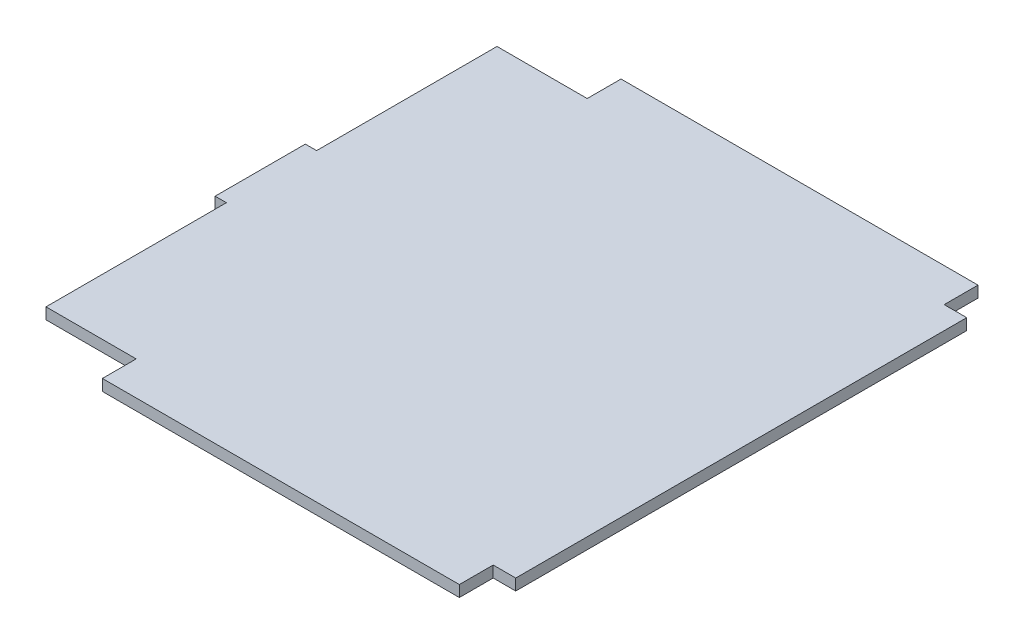
ISO-10303-21;
HEADER;
FILE_DESCRIPTION(('STEP AP214'),'2;1');
FILE_NAME('part.step','',(''),(''),'','','');
FILE_SCHEMA(('AUTOMOTIVE_DESIGN { 1 0 10303 214 1 1 1 1 }'));
ENDSEC;
DATA;
#1=APPLICATION_CONTEXT('core data for automotive mechanical design processes');
#2=APPLICATION_PROTOCOL_DEFINITION('international standard','automotive_design',2000,#1);
#3=PRODUCT_CONTEXT('',#1,'mechanical');
#4=PRODUCT('Part','Part','',(#3));
#5=PRODUCT_RELATED_PRODUCT_CATEGORY('part','',(#4));
#6=PRODUCT_DEFINITION_FORMATION('','',#4);
#7=PRODUCT_DEFINITION_CONTEXT('part definition',#1,'design');
#8=PRODUCT_DEFINITION('design','',#6,#7);
#9=PRODUCT_DEFINITION_SHAPE('','',#8);
#10=(LENGTH_UNIT() NAMED_UNIT(*) SI_UNIT(.MILLI.,.METRE.));
#11=(NAMED_UNIT(*) PLANE_ANGLE_UNIT() SI_UNIT($,.RADIAN.));
#12=(NAMED_UNIT(*) SI_UNIT($,.STERADIAN.) SOLID_ANGLE_UNIT());
#13=UNCERTAINTY_MEASURE_WITH_UNIT(LENGTH_MEASURE(1.E-05),#10,'distance_accuracy_value','');
#14=(GEOMETRIC_REPRESENTATION_CONTEXT(3) GLOBAL_UNCERTAINTY_ASSIGNED_CONTEXT((#13)) GLOBAL_UNIT_ASSIGNED_CONTEXT((#10,
#11,#12)) REPRESENTATION_CONTEXT('',''));
#15=CARTESIAN_POINT('',(0.,0.,0.));
#16=DIRECTION('',(0.,0.,1.));
#17=DIRECTION('',(1.,0.,0.));
#18=AXIS2_PLACEMENT_3D('',#15,#16,#17);
#19=CARTESIAN_POINT('',(0.,3.175,73.025));
#20=DIRECTION('',(0.,0.,1.));
#21=DIRECTION('',(1.,0.,0.));
#22=AXIS2_PLACEMENT_3D('',#19,#20,#21);
#23=PLANE('',#22);
#24=DIRECTION('',(-1.,0.,0.));
#25=VECTOR('',#24,1.);
#26=CARTESIAN_POINT('',(0.,0.,73.025));
#27=LINE('',#26,#25);
#28=CARTESIAN_POINT('',(59.7862566020001,0.,73.025));
#29=VERTEX_POINT('',#28);
#30=CARTESIAN_POINT('',(-40.7362566019999,0.,73.025));
#31=VERTEX_POINT('',#30);
#32=EDGE_CURVE('E249',#29,#31,#27,.T.);
#33=ORIENTED_EDGE('',*,*,#32,.F.);
#34=DIRECTION('',(0.,-1.,0.));
#35=VECTOR('',#34,1.);
#36=CARTESIAN_POINT('',(59.7862566020001,3.175,73.025));
#37=LINE('',#36,#35);
#38=CARTESIAN_POINT('',(59.7862566020001,3.175,73.025));
#39=VERTEX_POINT('',#38);
#40=EDGE_CURVE('E11',#39,#29,#37,.T.);
#41=ORIENTED_EDGE('',*,*,#40,.F.);
#42=DIRECTION('',(-1.,0.,0.));
#43=VECTOR('',#42,1.);
#44=CARTESIAN_POINT('',(0.,3.175,73.025));
#45=LINE('',#44,#43);
#46=CARTESIAN_POINT('',(-40.7362566019999,3.175,73.025));
#47=VERTEX_POINT('',#46);
#48=EDGE_CURVE('E204',#39,#47,#45,.T.);
#49=ORIENTED_EDGE('',*,*,#48,.T.);
#50=DIRECTION('',(0.,-1.,0.));
#51=VECTOR('',#50,1.);
#52=CARTESIAN_POINT('',(-40.7362566019999,3.175,73.025));
#53=LINE('',#52,#51);
#54=EDGE_CURVE('E51',#47,#31,#53,.T.);
#55=ORIENTED_EDGE('',*,*,#54,.T.);
#56=EDGE_LOOP('',(#33,#41,#49,#55));
#57=FACE_BOUND('',#56,.T.);
#58=ADVANCED_FACE('F35',(#57),#23,.T.);
#59=CARTESIAN_POINT('',(59.7862566020001,3.175,0.));
#60=DIRECTION('',(-1.,0.,0.));
#61=DIRECTION('',(0.,0.,1.));
#62=AXIS2_PLACEMENT_3D('',#59,#60,#61);
#63=PLANE('',#62);
#64=DIRECTION('',(0.,0.,-1.));
#65=VECTOR('',#64,1.);
#66=CARTESIAN_POINT('',(59.7862566020001,0.,0.));
#67=LINE('',#66,#65);
#68=CARTESIAN_POINT('',(59.7862566020001,0.,63.5));
#69=VERTEX_POINT('',#68);
#70=EDGE_CURVE('E247',#29,#69,#67,.T.);
#71=ORIENTED_EDGE('',*,*,#70,.T.);
#72=DIRECTION('',(0.,-1.,0.));
#73=VECTOR('',#72,1.);
#74=CARTESIAN_POINT('',(59.7862566020001,3.175,63.5));
#75=LINE('',#74,#73);
#76=CARTESIAN_POINT('',(59.7862566020001,3.175,63.5));
#77=VERTEX_POINT('',#76);
#78=EDGE_CURVE('E43',#77,#69,#75,.T.);
#79=ORIENTED_EDGE('',*,*,#78,.F.);
#80=DIRECTION('',(0.,0.,-1.));
#81=VECTOR('',#80,1.);
#82=CARTESIAN_POINT('',(59.7862566020001,3.175,0.));
#83=LINE('',#82,#81);
#84=EDGE_CURVE('E202',#39,#77,#83,.T.);
#85=ORIENTED_EDGE('',*,*,#84,.F.);
#86=ORIENTED_EDGE('',*,*,#40,.T.);
#87=EDGE_LOOP('',(#71,#79,#85,#86));
#88=FACE_BOUND('',#87,.T.);
#89=ADVANCED_FACE('F248',(#88),#63,.F.);
#90=CARTESIAN_POINT('',(0.,3.175,63.5));
#91=DIRECTION('',(0.,0.,1.));
#92=DIRECTION('',(1.,0.,0.));
#93=AXIS2_PLACEMENT_3D('',#90,#91,#92);
#94=PLANE('',#93);
#95=DIRECTION('',(-1.,0.,0.));
#96=VECTOR('',#95,1.);
#97=CARTESIAN_POINT('',(0.,0.,63.5));
#98=LINE('',#97,#96);
#99=CARTESIAN_POINT('',(66.136256602,0.,63.5));
#100=VERTEX_POINT('',#99);
#101=EDGE_CURVE('E243',#100,#69,#98,.T.);
#102=ORIENTED_EDGE('',*,*,#101,.F.);
#103=DIRECTION('',(0.,-1.,0.));
#104=VECTOR('',#103,1.);
#105=CARTESIAN_POINT('',(66.136256602,3.175,63.5));
#106=LINE('',#105,#104);
#107=CARTESIAN_POINT('',(66.136256602,3.175,63.5));
#108=VERTEX_POINT('',#107);
#109=EDGE_CURVE('E236',#108,#100,#106,.T.);
#110=ORIENTED_EDGE('',*,*,#109,.F.);
#111=DIRECTION('',(-1.,0.,0.));
#112=VECTOR('',#111,1.);
#113=CARTESIAN_POINT('',(0.,3.175,63.5));
#114=LINE('',#113,#112);
#115=EDGE_CURVE('E199',#108,#77,#114,.T.);
#116=ORIENTED_EDGE('',*,*,#115,.T.);
#117=ORIENTED_EDGE('',*,*,#78,.T.);
#118=EDGE_LOOP('',(#102,#110,#116,#117));
#119=FACE_BOUND('',#118,.T.);
#120=ADVANCED_FACE('F241',(#119),#94,.T.);
#121=CARTESIAN_POINT('',(66.136256602,3.175,0.));
#122=DIRECTION('',(-1.,0.,0.));
#123=DIRECTION('',(0.,0.,1.));
#124=AXIS2_PLACEMENT_3D('',#121,#122,#123);
#125=PLANE('',#124);
#126=DIRECTION('',(0.,0.,-1.));
#127=VECTOR('',#126,1.);
#128=CARTESIAN_POINT('',(66.136256602,0.,0.));
#129=LINE('',#128,#127);
#130=CARTESIAN_POINT('',(66.136256602,0.,-63.5));
#131=VERTEX_POINT('',#130);
#132=EDGE_CURVE('E254',#100,#131,#129,.T.);
#133=ORIENTED_EDGE('',*,*,#132,.T.);
#134=DIRECTION('',(0.,-1.,0.));
#135=VECTOR('',#134,1.);
#136=CARTESIAN_POINT('',(66.136256602,3.175,-63.5));
#137=LINE('',#136,#135);
#138=CARTESIAN_POINT('',(66.136256602,3.175,-63.5));
#139=VERTEX_POINT('',#138);
#140=EDGE_CURVE('E233',#139,#131,#137,.T.);
#141=ORIENTED_EDGE('',*,*,#140,.F.);
#142=DIRECTION('',(0.,0.,-1.));
#143=VECTOR('',#142,1.);
#144=CARTESIAN_POINT('',(66.136256602,3.175,0.));
#145=LINE('',#144,#143);
#146=EDGE_CURVE('E197',#108,#139,#145,.T.);
#147=ORIENTED_EDGE('',*,*,#146,.F.);
#148=ORIENTED_EDGE('',*,*,#109,.T.);
#149=EDGE_LOOP('',(#133,#141,#147,#148));
#150=FACE_BOUND('',#149,.T.);
#151=ADVANCED_FACE('F320',(#150),#125,.F.);
#152=CARTESIAN_POINT('',(0.,3.175,-63.5));
#153=DIRECTION('',(0.,0.,1.));
#154=DIRECTION('',(1.,0.,0.));
#155=AXIS2_PLACEMENT_3D('',#152,#153,#154);
#156=PLANE('',#155);
#157=DIRECTION('',(-1.,0.,0.));
#158=VECTOR('',#157,1.);
#159=CARTESIAN_POINT('',(0.,0.,-63.5));
#160=LINE('',#159,#158);
#161=CARTESIAN_POINT('',(59.786256602,0.,-63.5));
#162=VERTEX_POINT('',#161);
#163=EDGE_CURVE('E256',#131,#162,#160,.T.);
#164=ORIENTED_EDGE('',*,*,#163,.T.);
#165=DIRECTION('',(0.,-1.,0.));
#166=VECTOR('',#165,1.);
#167=CARTESIAN_POINT('',(59.786256602,3.175,-63.5));
#168=LINE('',#167,#166);
#169=CARTESIAN_POINT('',(59.786256602,3.175,-63.5));
#170=VERTEX_POINT('',#169);
#171=EDGE_CURVE('E231',#170,#162,#168,.T.);
#172=ORIENTED_EDGE('',*,*,#171,.F.);
#173=DIRECTION('',(-1.,0.,0.));
#174=VECTOR('',#173,1.);
#175=CARTESIAN_POINT('',(0.,3.175,-63.5));
#176=LINE('',#175,#174);
#177=EDGE_CURVE('E195',#139,#170,#176,.T.);
#178=ORIENTED_EDGE('',*,*,#177,.F.);
#179=ORIENTED_EDGE('',*,*,#140,.T.);
#180=EDGE_LOOP('',(#164,#172,#178,#179));
#181=FACE_BOUND('',#180,.T.);
#182=ADVANCED_FACE('F315',(#181),#156,.F.);
#183=CARTESIAN_POINT('',(59.7862566020001,3.175,0.));
#184=DIRECTION('',(1.,0.,0.));
#185=DIRECTION('',(0.,0.,-1.));
#186=AXIS2_PLACEMENT_3D('',#183,#184,#185);
#187=PLANE('',#186);
#188=DIRECTION('',(0.,0.,1.));
#189=VECTOR('',#188,1.);
#190=CARTESIAN_POINT('',(59.7862566020001,0.,0.));
#191=LINE('',#190,#189);
#192=CARTESIAN_POINT('',(59.786256602,0.,-73.025));
#193=VERTEX_POINT('',#192);
#194=EDGE_CURVE('E262',#193,#162,#191,.T.);
#195=ORIENTED_EDGE('',*,*,#194,.F.);
#196=DIRECTION('',(0.,-1.,0.));
#197=VECTOR('',#196,1.);
#198=CARTESIAN_POINT('',(59.786256602,3.175,-73.025));
#199=LINE('',#198,#197);
#200=CARTESIAN_POINT('',(59.786256602,3.175,-73.025));
#201=VERTEX_POINT('',#200);
#202=EDGE_CURVE('E229',#201,#193,#199,.T.);
#203=ORIENTED_EDGE('',*,*,#202,.F.);
#204=DIRECTION('',(0.,0.,1.));
#205=VECTOR('',#204,1.);
#206=CARTESIAN_POINT('',(59.7862566020001,3.175,0.));
#207=LINE('',#206,#205);
#208=EDGE_CURVE('E192',#201,#170,#207,.T.);
#209=ORIENTED_EDGE('',*,*,#208,.T.);
#210=ORIENTED_EDGE('',*,*,#171,.T.);
#211=EDGE_LOOP('',(#195,#203,#209,#210));
#212=FACE_BOUND('',#211,.T.);
#213=ADVANCED_FACE('F312',(#212),#187,.T.);
#214=CARTESIAN_POINT('',(0.,3.175,-73.025));
#215=DIRECTION('',(0.,0.,1.));
#216=DIRECTION('',(1.,0.,0.));
#217=AXIS2_PLACEMENT_3D('',#214,#215,#216);
#218=PLANE('',#217);
#219=DIRECTION('',(-1.,0.,0.));
#220=VECTOR('',#219,1.);
#221=CARTESIAN_POINT('',(0.,0.,-73.025));
#222=LINE('',#221,#220);
#223=CARTESIAN_POINT('',(-40.7362566019999,0.,-73.025));
#224=VERTEX_POINT('',#223);
#225=EDGE_CURVE('E265',#193,#224,#222,.T.);
#226=ORIENTED_EDGE('',*,*,#225,.T.);
#227=DIRECTION('',(0.,-1.,0.));
#228=VECTOR('',#227,1.);
#229=CARTESIAN_POINT('',(-40.7362566019999,3.175,-73.025));
#230=LINE('',#229,#228);
#231=CARTESIAN_POINT('',(-40.7362566019999,3.175,-73.025));
#232=VERTEX_POINT('',#231);
#233=EDGE_CURVE('E226',#232,#224,#230,.T.);
#234=ORIENTED_EDGE('',*,*,#233,.F.);
#235=DIRECTION('',(-1.,0.,0.));
#236=VECTOR('',#235,1.);
#237=CARTESIAN_POINT('',(0.,3.175,-73.025));
#238=LINE('',#237,#236);
#239=EDGE_CURVE('E188',#201,#232,#238,.T.);
#240=ORIENTED_EDGE('',*,*,#239,.F.);
#241=ORIENTED_EDGE('',*,*,#202,.T.);
#242=EDGE_LOOP('',(#226,#234,#240,#241));
#243=FACE_BOUND('',#242,.T.);
#244=ADVANCED_FACE('F309',(#243),#218,.F.);
#245=CARTESIAN_POINT('',(-40.7362566019999,3.175,0.));
#246=DIRECTION('',(1.,0.,0.));
#247=DIRECTION('',(0.,0.,-1.));
#248=AXIS2_PLACEMENT_3D('',#245,#246,#247);
#249=PLANE('',#248);
#250=DIRECTION('',(0.,0.,1.));
#251=VECTOR('',#250,1.);
#252=CARTESIAN_POINT('',(-40.7362566019999,0.,0.));
#253=LINE('',#252,#251);
#254=CARTESIAN_POINT('',(-40.7362566019999,0.,-63.5));
#255=VERTEX_POINT('',#254);
#256=EDGE_CURVE('E267',#224,#255,#253,.T.);
#257=ORIENTED_EDGE('',*,*,#256,.T.);
#258=DIRECTION('',(0.,-1.,0.));
#259=VECTOR('',#258,1.);
#260=CARTESIAN_POINT('',(-40.7362566019999,3.175,-63.5));
#261=LINE('',#260,#259);
#262=CARTESIAN_POINT('',(-40.7362566019999,3.175,-63.5));
#263=VERTEX_POINT('',#262);
#264=EDGE_CURVE('E224',#263,#255,#261,.T.);
#265=ORIENTED_EDGE('',*,*,#264,.F.);
#266=DIRECTION('',(0.,0.,1.));
#267=VECTOR('',#266,1.);
#268=CARTESIAN_POINT('',(-40.7362566019999,3.175,0.));
#269=LINE('',#268,#267);
#270=EDGE_CURVE('E185',#232,#263,#269,.T.);
#271=ORIENTED_EDGE('',*,*,#270,.F.);
#272=ORIENTED_EDGE('',*,*,#233,.T.);
#273=EDGE_LOOP('',(#257,#265,#271,#272));
#274=FACE_BOUND('',#273,.T.);
#275=ADVANCED_FACE('F304',(#274),#249,.F.);
#276=CARTESIAN_POINT('',(0.,3.175,-63.5));
#277=DIRECTION('',(0.,0.,-1.));
#278=DIRECTION('',(-1.,0.,0.));
#279=AXIS2_PLACEMENT_3D('',#276,#277,#278);
#280=PLANE('',#279);
#281=DIRECTION('',(1.,0.,0.));
#282=VECTOR('',#281,1.);
#283=CARTESIAN_POINT('',(0.,0.,-63.5));
#284=LINE('',#283,#282);
#285=CARTESIAN_POINT('',(-66.136256602,0.,-63.5));
#286=VERTEX_POINT('',#285);
#287=EDGE_CURVE('E270',#286,#255,#284,.T.);
#288=ORIENTED_EDGE('',*,*,#287,.F.);
#289=DIRECTION('',(0.,-1.,0.));
#290=VECTOR('',#289,1.);
#291=CARTESIAN_POINT('',(-66.136256602,3.175,-63.5));
#292=LINE('',#291,#290);
#293=CARTESIAN_POINT('',(-66.136256602,3.175,-63.5));
#294=VERTEX_POINT('',#293);
#295=EDGE_CURVE('E222',#294,#286,#292,.T.);
#296=ORIENTED_EDGE('',*,*,#295,.F.);
#297=DIRECTION('',(1.,0.,0.));
#298=VECTOR('',#297,1.);
#299=CARTESIAN_POINT('',(0.,3.175,-63.5));
#300=LINE('',#299,#298);
#301=EDGE_CURVE('E181',#294,#263,#300,.T.);
#302=ORIENTED_EDGE('',*,*,#301,.T.);
#303=ORIENTED_EDGE('',*,*,#264,.T.);
#304=EDGE_LOOP('',(#288,#296,#302,#303));
#305=FACE_BOUND('',#304,.T.);
#306=ADVANCED_FACE('F298',(#305),#280,.T.);
#307=CARTESIAN_POINT('',(-66.136256602,3.175,0.));
#308=DIRECTION('',(-1.,0.,0.));
#309=DIRECTION('',(0.,0.,1.));
#310=AXIS2_PLACEMENT_3D('',#307,#308,#309);
#311=PLANE('',#310);
#312=DIRECTION('',(0.,0.,-1.));
#313=VECTOR('',#312,1.);
#314=CARTESIAN_POINT('',(-66.136256602,0.,0.));
#315=LINE('',#314,#313);
#316=CARTESIAN_POINT('',(-66.136256602,0.,-12.7));
#317=VERTEX_POINT('',#316);
#318=EDGE_CURVE('E273',#317,#286,#315,.T.);
#319=ORIENTED_EDGE('',*,*,#318,.F.);
#320=DIRECTION('',(0.,-1.,0.));
#321=VECTOR('',#320,1.);
#322=CARTESIAN_POINT('',(-66.136256602,3.175,-12.7));
#323=LINE('',#322,#321);
#324=CARTESIAN_POINT('',(-66.136256602,3.175,-12.7));
#325=VERTEX_POINT('',#324);
#326=EDGE_CURVE('E220',#325,#317,#323,.T.);
#327=ORIENTED_EDGE('',*,*,#326,.F.);
#328=DIRECTION('',(0.,0.,-1.));
#329=VECTOR('',#328,1.);
#330=CARTESIAN_POINT('',(-66.136256602,3.175,0.));
#331=LINE('',#330,#329);
#332=EDGE_CURVE('E174',#325,#294,#331,.T.);
#333=ORIENTED_EDGE('',*,*,#332,.T.);
#334=ORIENTED_EDGE('',*,*,#295,.T.);
#335=EDGE_LOOP('',(#319,#327,#333,#334));
#336=FACE_BOUND('',#335,.T.);
#337=ADVANCED_FACE('F296',(#336),#311,.T.);
#338=CARTESIAN_POINT('',(0.,3.175,-12.7));
#339=DIRECTION('',(0.,0.,1.));
#340=DIRECTION('',(1.,0.,0.));
#341=AXIS2_PLACEMENT_3D('',#338,#339,#340);
#342=PLANE('',#341);
#343=DIRECTION('',(-1.,0.,0.));
#344=VECTOR('',#343,1.);
#345=CARTESIAN_POINT('',(0.,0.,-12.7));
#346=LINE('',#345,#344);
#347=CARTESIAN_POINT('',(-69.311256602,0.,-12.7));
#348=VERTEX_POINT('',#347);
#349=EDGE_CURVE('E276',#317,#348,#346,.T.);
#350=ORIENTED_EDGE('',*,*,#349,.T.);
#351=DIRECTION('',(0.,-1.,0.));
#352=VECTOR('',#351,1.);
#353=CARTESIAN_POINT('',(-69.311256602,3.175,-12.7));
#354=LINE('',#353,#352);
#355=CARTESIAN_POINT('',(-69.311256602,3.175,-12.7));
#356=VERTEX_POINT('',#355);
#357=EDGE_CURVE('E218',#356,#348,#354,.T.);
#358=ORIENTED_EDGE('',*,*,#357,.F.);
#359=DIRECTION('',(-1.,0.,0.));
#360=VECTOR('',#359,1.);
#361=CARTESIAN_POINT('',(0.,3.175,-12.7));
#362=LINE('',#361,#360);
#363=EDGE_CURVE('E180',#325,#356,#362,.T.);
#364=ORIENTED_EDGE('',*,*,#363,.F.);
#365=ORIENTED_EDGE('',*,*,#326,.T.);
#366=EDGE_LOOP('',(#350,#358,#364,#365));
#367=FACE_BOUND('',#366,.T.);
#368=ADVANCED_FACE('F294',(#367),#342,.F.);
#369=CARTESIAN_POINT('',(-69.311256602,3.175,0.));
#370=DIRECTION('',(-1.,0.,0.));
#371=DIRECTION('',(0.,0.,1.));
#372=AXIS2_PLACEMENT_3D('',#369,#370,#371);
#373=PLANE('',#372);
#374=DIRECTION('',(0.,0.,-1.));
#375=VECTOR('',#374,1.);
#376=CARTESIAN_POINT('',(-69.311256602,0.,0.));
#377=LINE('',#376,#375);
#378=CARTESIAN_POINT('',(-69.311256602,0.,12.7));
#379=VERTEX_POINT('',#378);
#380=EDGE_CURVE('E279',#379,#348,#377,.T.);
#381=ORIENTED_EDGE('',*,*,#380,.F.);
#382=DIRECTION('',(0.,-1.,0.));
#383=VECTOR('',#382,1.);
#384=CARTESIAN_POINT('',(-69.311256602,3.175,12.7));
#385=LINE('',#384,#383);
#386=CARTESIAN_POINT('',(-69.311256602,3.175,12.7));
#387=VERTEX_POINT('',#386);
#388=EDGE_CURVE('E216',#387,#379,#385,.T.);
#389=ORIENTED_EDGE('',*,*,#388,.F.);
#390=DIRECTION('',(0.,0.,-1.));
#391=VECTOR('',#390,1.);
#392=CARTESIAN_POINT('',(-69.311256602,3.175,0.));
#393=LINE('',#392,#391);
#394=EDGE_CURVE('E175',#387,#356,#393,.T.);
#395=ORIENTED_EDGE('',*,*,#394,.T.);
#396=ORIENTED_EDGE('',*,*,#357,.T.);
#397=EDGE_LOOP('',(#381,#389,#395,#396));
#398=FACE_BOUND('',#397,.T.);
#399=ADVANCED_FACE('F290',(#398),#373,.T.);
#400=CARTESIAN_POINT('',(0.,3.175,12.7));
#401=DIRECTION('',(0.,0.,1.));
#402=DIRECTION('',(1.,0.,0.));
#403=AXIS2_PLACEMENT_3D('',#400,#401,#402);
#404=PLANE('',#403);
#405=DIRECTION('',(-1.,0.,0.));
#406=VECTOR('',#405,1.);
#407=CARTESIAN_POINT('',(0.,0.,12.7));
#408=LINE('',#407,#406);
#409=CARTESIAN_POINT('',(-66.136256602,0.,12.7));
#410=VERTEX_POINT('',#409);
#411=EDGE_CURVE('E281',#410,#379,#408,.T.);
#412=ORIENTED_EDGE('',*,*,#411,.F.);
#413=DIRECTION('',(0.,-1.,0.));
#414=VECTOR('',#413,1.);
#415=CARTESIAN_POINT('',(-66.136256602,3.175,12.7));
#416=LINE('',#415,#414);
#417=CARTESIAN_POINT('',(-66.136256602,3.175,12.7));
#418=VERTEX_POINT('',#417);
#419=EDGE_CURVE('E159',#418,#410,#416,.T.);
#420=ORIENTED_EDGE('',*,*,#419,.F.);
#421=DIRECTION('',(-1.,0.,0.));
#422=VECTOR('',#421,1.);
#423=CARTESIAN_POINT('',(0.,3.175,12.7));
#424=LINE('',#423,#422);
#425=EDGE_CURVE('E172',#418,#387,#424,.T.);
#426=ORIENTED_EDGE('',*,*,#425,.T.);
#427=ORIENTED_EDGE('',*,*,#388,.T.);
#428=EDGE_LOOP('',(#412,#420,#426,#427));
#429=FACE_BOUND('',#428,.T.);
#430=ADVANCED_FACE('F287',(#429),#404,.T.);
#431=CARTESIAN_POINT('',(-66.136256602,0.,63.5));
#432=VERTEX_POINT('',#431);
#433=EDGE_CURVE('E156',#432,#410,#315,.T.);
#434=ORIENTED_EDGE('',*,*,#433,.F.);
#435=DIRECTION('',(0.,-1.,0.));
#436=VECTOR('',#435,1.);
#437=CARTESIAN_POINT('',(-66.136256602,3.175,63.5));
#438=LINE('',#437,#436);
#439=CARTESIAN_POINT('',(-66.136256602,3.175,63.5));
#440=VERTEX_POINT('',#439);
#441=EDGE_CURVE('E150',#440,#432,#438,.T.);
#442=ORIENTED_EDGE('',*,*,#441,.F.);
#443=EDGE_CURVE('E154',#440,#418,#331,.T.);
#444=ORIENTED_EDGE('',*,*,#443,.T.);
#445=ORIENTED_EDGE('',*,*,#419,.T.);
#446=EDGE_LOOP('',(#434,#442,#444,#445));
#447=FACE_BOUND('',#446,.T.);
#448=ADVANCED_FACE('F152',(#447),#311,.T.);
#449=CARTESIAN_POINT('',(0.,3.175,63.5));
#450=DIRECTION('',(0.,0.,-1.));
#451=DIRECTION('',(-1.,0.,0.));
#452=AXIS2_PLACEMENT_3D('',#449,#450,#451);
#453=PLANE('',#452);
#454=DIRECTION('',(1.,0.,0.));
#455=VECTOR('',#454,1.);
#456=CARTESIAN_POINT('',(0.,0.,63.5));
#457=LINE('',#456,#455);
#458=CARTESIAN_POINT('',(-40.7362566019999,0.,63.5));
#459=VERTEX_POINT('',#458);
#460=EDGE_CURVE('E207',#432,#459,#457,.T.);
#461=ORIENTED_EDGE('',*,*,#460,.T.);
#462=DIRECTION('',(0.,-1.,0.));
#463=VECTOR('',#462,1.);
#464=CARTESIAN_POINT('',(-40.7362566019999,3.175,63.5));
#465=LINE('',#464,#463);
#466=CARTESIAN_POINT('',(-40.7362566019999,3.175,63.5));
#467=VERTEX_POINT('',#466);
#468=EDGE_CURVE('E101',#467,#459,#465,.T.);
#469=ORIENTED_EDGE('',*,*,#468,.F.);
#470=DIRECTION('',(1.,0.,0.));
#471=VECTOR('',#470,1.);
#472=CARTESIAN_POINT('',(0.,3.175,63.5));
#473=LINE('',#472,#471);
#474=EDGE_CURVE('E161',#440,#467,#473,.T.);
#475=ORIENTED_EDGE('',*,*,#474,.F.);
#476=ORIENTED_EDGE('',*,*,#441,.T.);
#477=EDGE_LOOP('',(#461,#469,#475,#476));
#478=FACE_BOUND('',#477,.T.);
#479=ADVANCED_FACE('F162',(#478),#453,.F.);
#480=CARTESIAN_POINT('',(-40.736256602,3.175,0.));
#481=DIRECTION('',(-1.,0.,0.));
#482=DIRECTION('',(0.,0.,1.));
#483=AXIS2_PLACEMENT_3D('',#480,#481,#482);
#484=PLANE('',#483);
#485=DIRECTION('',(0.,0.,-1.));
#486=VECTOR('',#485,1.);
#487=CARTESIAN_POINT('',(-40.736256602,0.,0.));
#488=LINE('',#487,#486);
#489=EDGE_CURVE('E205',#31,#459,#488,.T.);
#490=ORIENTED_EDGE('',*,*,#489,.F.);
#491=ORIENTED_EDGE('',*,*,#54,.F.);
#492=DIRECTION('',(0.,0.,-1.));
#493=VECTOR('',#492,1.);
#494=CARTESIAN_POINT('',(-40.736256602,3.175,0.));
#495=LINE('',#494,#493);
#496=EDGE_CURVE('E165',#47,#467,#495,.T.);
#497=ORIENTED_EDGE('',*,*,#496,.T.);
#498=ORIENTED_EDGE('',*,*,#468,.T.);
#499=EDGE_LOOP('',(#490,#491,#497,#498));
#500=FACE_BOUND('',#499,.T.);
#501=ADVANCED_FACE('F322',(#500),#484,.T.);
#502=CARTESIAN_POINT('',(0.,3.175,0.));
#503=DIRECTION('',(0.,1.,0.));
#504=DIRECTION('',(0.,0.,1.));
#505=AXIS2_PLACEMENT_3D('',#502,#503,#504);
#506=PLANE('',#505);
#507=ORIENTED_EDGE('',*,*,#48,.F.);
#508=ORIENTED_EDGE('',*,*,#84,.T.);
#509=ORIENTED_EDGE('',*,*,#115,.F.);
#510=ORIENTED_EDGE('',*,*,#146,.T.);
#511=ORIENTED_EDGE('',*,*,#177,.T.);
#512=ORIENTED_EDGE('',*,*,#208,.F.);
#513=ORIENTED_EDGE('',*,*,#239,.T.);
#514=ORIENTED_EDGE('',*,*,#270,.T.);
#515=ORIENTED_EDGE('',*,*,#301,.F.);
#516=ORIENTED_EDGE('',*,*,#332,.F.);
#517=ORIENTED_EDGE('',*,*,#363,.T.);
#518=ORIENTED_EDGE('',*,*,#394,.F.);
#519=ORIENTED_EDGE('',*,*,#425,.F.);
#520=ORIENTED_EDGE('',*,*,#443,.F.);
#521=ORIENTED_EDGE('',*,*,#474,.T.);
#522=ORIENTED_EDGE('',*,*,#496,.F.);
#523=EDGE_LOOP('',(#507,#508,#509,#510,#511,#512,#513,#514,#515,#516,#517,#518,#519,#520,#521,#522));
#524=FACE_BOUND('',#523,.T.);
#525=ADVANCED_FACE('F169',(#524),#506,.T.);
#526=CARTESIAN_POINT('',(0.,0.,0.));
#527=DIRECTION('',(0.,1.,0.));
#528=DIRECTION('',(0.,0.,1.));
#529=AXIS2_PLACEMENT_3D('',#526,#527,#528);
#530=PLANE('',#529);
#531=ORIENTED_EDGE('',*,*,#32,.T.);
#532=ORIENTED_EDGE('',*,*,#489,.T.);
#533=ORIENTED_EDGE('',*,*,#460,.F.);
#534=ORIENTED_EDGE('',*,*,#433,.T.);
#535=ORIENTED_EDGE('',*,*,#411,.T.);
#536=ORIENTED_EDGE('',*,*,#380,.T.);
#537=ORIENTED_EDGE('',*,*,#349,.F.);
#538=ORIENTED_EDGE('',*,*,#318,.T.);
#539=ORIENTED_EDGE('',*,*,#287,.T.);
#540=ORIENTED_EDGE('',*,*,#256,.F.);
#541=ORIENTED_EDGE('',*,*,#225,.F.);
#542=ORIENTED_EDGE('',*,*,#194,.T.);
#543=ORIENTED_EDGE('',*,*,#163,.F.);
#544=ORIENTED_EDGE('',*,*,#132,.F.);
#545=ORIENTED_EDGE('',*,*,#101,.T.);
#546=ORIENTED_EDGE('',*,*,#70,.F.);
#547=EDGE_LOOP('',(#531,#532,#533,#534,#535,#536,#537,#538,#539,#540,#541,#542,#543,#544,#545,#546));
#548=FACE_BOUND('',#547,.T.);
#549=ADVANCED_FACE('F252',(#548),#530,.F.);
#550=CLOSED_SHELL('',(#58,#89,#120,#151,#182,#213,#244,#275,#306,#337,#368,#399,#430,#448,#479,
#501,#525,#549));
#551=MANIFOLD_SOLID_BREP('B2',#550);
#552=ADVANCED_BREP_SHAPE_REPRESENTATION('',(#18,#551),#14);
#553=SHAPE_DEFINITION_REPRESENTATION(#9,#552);
ENDSEC;
END-ISO-10303-21;
